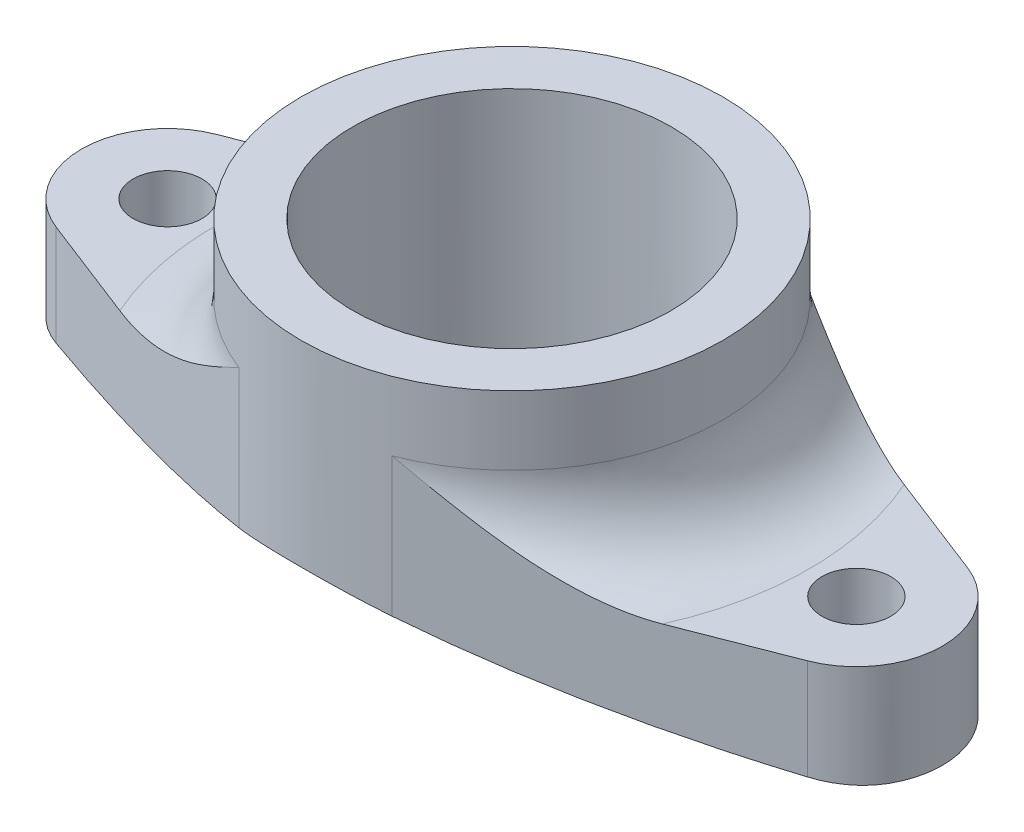
ISO-10303-21;
HEADER;
FILE_DESCRIPTION(('STEP AP214'),'2;1');
FILE_NAME('part.step','',(''),(''),'','','');
FILE_SCHEMA(('AUTOMOTIVE_DESIGN { 1 0 10303 214 1 1 1 1 }'));
ENDSEC;
DATA;
#1=APPLICATION_CONTEXT('core data for automotive mechanical design processes');
#2=APPLICATION_PROTOCOL_DEFINITION('international standard','automotive_design',2000,#1);
#3=PRODUCT_CONTEXT('',#1,'mechanical');
#4=PRODUCT('Part','Part','',(#3));
#5=PRODUCT_RELATED_PRODUCT_CATEGORY('part','',(#4));
#6=PRODUCT_DEFINITION_FORMATION('','',#4);
#7=PRODUCT_DEFINITION_CONTEXT('part definition',#1,'design');
#8=PRODUCT_DEFINITION('design','',#6,#7);
#9=PRODUCT_DEFINITION_SHAPE('','',#8);
#10=(LENGTH_UNIT() NAMED_UNIT(*) SI_UNIT(.MILLI.,.METRE.));
#11=(NAMED_UNIT(*) PLANE_ANGLE_UNIT() SI_UNIT($,.RADIAN.));
#12=(NAMED_UNIT(*) SI_UNIT($,.STERADIAN.) SOLID_ANGLE_UNIT());
#13=UNCERTAINTY_MEASURE_WITH_UNIT(LENGTH_MEASURE(1.E-05),#10,'distance_accuracy_value','');
#14=(GEOMETRIC_REPRESENTATION_CONTEXT(3) GLOBAL_UNCERTAINTY_ASSIGNED_CONTEXT((#13)) GLOBAL_UNIT_ASSIGNED_CONTEXT((#10,
#11,#12)) REPRESENTATION_CONTEXT('',''));
#15=CARTESIAN_POINT('',(0.,0.,0.));
#16=DIRECTION('',(0.,0.,1.));
#17=DIRECTION('',(1.,0.,0.));
#18=AXIS2_PLACEMENT_3D('',#15,#16,#17);
#19=CARTESIAN_POINT('',(43.625,30.,9.31983771317934));
#20=DIRECTION('',(-0.3625,0.,-0.931983771317935));
#21=DIRECTION('',(0.931983771317935,0.,-0.3625));
#22=AXIS2_PLACEMENT_3D('',#19,#20,#21);
#23=PLANE('',#22);
#24=DIRECTION('',(0.,-1.,0.));
#25=VECTOR('',#24,1.);
#26=CARTESIAN_POINT('',(43.625,30.,9.31983771317934));
#27=LINE('',#26,#25);
#28=CARTESIAN_POINT('',(43.625,12.,9.31983771317934));
#29=VERTEX_POINT('',#28);
#30=CARTESIAN_POINT('',(43.625,0.312645753927591,9.31983771317934));
#31=VERTEX_POINT('',#30);
#32=EDGE_CURVE('E186',#29,#31,#27,.T.);
#33=ORIENTED_EDGE('',*,*,#32,.F.);
#34=DIRECTION('',(-0.931983771317935,0.,0.3625));
#35=VECTOR('',#34,1.);
#36=CARTESIAN_POINT('',(43.625,12.,9.31983771317934));
#37=LINE('',#36,#35);
#38=CARTESIAN_POINT('',(31.5190571486617,12.,14.0285079912083));
#39=VERTEX_POINT('',#38);
#40=EDGE_CURVE('E290',#29,#39,#37,.T.);
#41=ORIENTED_EDGE('',*,*,#40,.T.);
#42=CARTESIAN_POINT('',(31.5190571486617,12.,14.0285079912083));
#43=CARTESIAN_POINT('',(31.2081161362249,12.0000073378622,14.1494501368521));
#44=CARTESIAN_POINT('',(30.8972525904942,12.0082756531448,14.2703621514122));
#45=CARTESIAN_POINT('',(30.2763168687535,12.0403376641738,14.5118783731085));
#46=CARTESIAN_POINT('',(29.9662444667264,12.0641262695673,14.6324826681553));
#47=CARTESIAN_POINT('',(29.0391969426042,12.1571533080677,14.9930626887913));
#48=CARTESIAN_POINT('',(28.4240461430392,12.2480616970899,15.2323288345172));
#49=CARTESIAN_POINT('',(27.2122428855278,12.4783617337884,15.7036660984984));
#50=CARTESIAN_POINT('',(26.61545225371,12.6169420095869,15.9357909602093));
#51=CARTESIAN_POINT('',(25.4315623110756,12.9364455773892,16.3962711932482));
#52=CARTESIAN_POINT('',(24.8444683375353,13.117391408088,16.6246244886145));
#53=CARTESIAN_POINT('',(23.5755848460668,13.5518396718945,17.1181634104424));
#54=CARTESIAN_POINT('',(22.8959525829643,13.8125506148254,17.3825099612694));
#55=CARTESIAN_POINT('',(21.5519217989401,14.376133244832,17.9052778186108));
#56=CARTESIAN_POINT('',(20.8875292825177,14.6790212283797,18.1636967896434));
#57=CARTESIAN_POINT('',(19.5725136091469,15.3195610469767,18.6751790667681));
#58=CARTESIAN_POINT('',(18.921909889942,15.6572584712307,18.9282348124473));
#59=CARTESIAN_POINT('',(17.6339001229477,16.3601085811493,19.4292129999485));
#60=CARTESIAN_POINT('',(16.9964926103165,16.725258198422,19.6771360115285));
#61=CARTESIAN_POINT('',(15.090378239101,17.8586796798977,20.4185292426451));
#62=CARTESIAN_POINT('',(13.8385669567911,18.6594284513701,20.9054278387394));
#63=CARTESIAN_POINT('',(11.359773366539,20.3011376891648,21.8695676704831));
#64=CARTESIAN_POINT('',(10.1327780960866,21.142076347799,22.3468139479692));
#65=CARTESIAN_POINT('',(8.89764093223173,21.9887639871967,22.8272270578073));
#66=CARTESIAN_POINT('',(8.88944546671112,21.9943819936824,22.8304147273168));
#67=CARTESIAN_POINT('',(8.88125,22.,22.8336023972894));
#68=B_SPLINE_CURVE_WITH_KNOTS('',3,(#42,#43,#44,#45,#46,#47,#48,#49,#50,#51,#52,#53,#54,#55,#56,
#57,#58,#59,#60,#61,#62,#63,#64,#65,#66,#67),.UNSPECIFIED.,.F.,.F.,(4,2,2,2,2,2,2,2,2,2,2,2,4),
(0.,1.0006596436552,2.00099125531729,3.99733968031262,5.96126632802749,7.92624017854258,
10.2479281160946,12.5705156153714,14.8961845684894,17.2215939618437,21.9107675400887,
26.5974249619817,26.6287299136658),.UNSPECIFIED.);
#69=CARTESIAN_POINT('',(8.88125,22.,22.8336023972894));
#70=VERTEX_POINT('',#69);
#71=EDGE_CURVE('E247',#70,#39,#68,.F.);
#72=ORIENTED_EDGE('',*,*,#71,.F.);
#73=DIRECTION('',(0.,-1.,0.));
#74=VECTOR('',#73,1.);
#75=CARTESIAN_POINT('',(8.88125,30.,22.8336023972894));
#76=LINE('',#75,#74);
#77=CARTESIAN_POINT('',(8.88125,5.87609845950715,22.8336023972894));
#78=VERTEX_POINT('',#77);
#79=EDGE_CURVE('E183',#70,#78,#76,.T.);
#80=ORIENTED_EDGE('',*,*,#79,.T.);
#81=CARTESIAN_POINT('',(54.7312583266492,30.,5.));
#82=DIRECTION('',(0.3625,0.,0.931983771317935));
#83=DIRECTION('',(0.931983771317934,0.,-0.3625));
#84=AXIS2_PLACEMENT_3D('',#81,#82,#83);
#85=ELLIPSE('',#84,82.7586206896551,30.);
#86=EDGE_CURVE('E319',#31,#78,#85,.F.);
#87=ORIENTED_EDGE('',*,*,#86,.F.);
#88=EDGE_LOOP('',(#33,#41,#72,#80,#87));
#89=FACE_BOUND('',#88,.T.);
#90=ADVANCED_FACE('F39',(#89),#23,.F.);
#91=CARTESIAN_POINT('',(-43.625,30.,9.31983771317934));
#92=DIRECTION('',(0.3625,0.,-0.931983771317935));
#93=DIRECTION('',(0.931983771317935,0.,0.3625));
#94=AXIS2_PLACEMENT_3D('',#91,#92,#93);
#95=PLANE('',#94);
#96=DIRECTION('',(0.,-1.,0.));
#97=VECTOR('',#96,1.);
#98=CARTESIAN_POINT('',(-8.88125,30.,22.8336023972894));
#99=LINE('',#98,#97);
#100=CARTESIAN_POINT('',(-8.88125,22.,22.8336023972894));
#101=VERTEX_POINT('',#100);
#102=CARTESIAN_POINT('',(-8.88125,5.87609845950715,22.8336023972894));
#103=VERTEX_POINT('',#102);
#104=EDGE_CURVE('E180',#101,#103,#99,.T.);
#105=ORIENTED_EDGE('',*,*,#104,.F.);
#106=CARTESIAN_POINT('',(-31.5190571486617,12.,14.0285079912083));
#107=CARTESIAN_POINT('',(-31.2081161362239,12.0000073378622,14.1494501368525));
#108=CARTESIAN_POINT('',(-30.8972525904923,12.0082756531449,14.270362151413));
#109=CARTESIAN_POINT('',(-30.2763168687496,12.040337664174,14.51187837311));
#110=CARTESIAN_POINT('',(-29.9662444667216,12.0641262695677,14.6324826681572));
#111=CARTESIAN_POINT('',(-29.0391969425969,12.1571533080686,14.9930626887942));
#112=CARTESIAN_POINT('',(-28.4240461430304,12.2480616970913,15.2323288345206));
#113=CARTESIAN_POINT('',(-27.2122428855195,12.4783617337903,15.7036660985017));
#114=CARTESIAN_POINT('',(-26.6154522537036,12.6169420095885,15.9357909602118));
#115=CARTESIAN_POINT('',(-25.4315623110725,12.9364455773901,16.3962711932494));
#116=CARTESIAN_POINT('',(-24.8444683375338,13.1173914080885,16.6246244886151));
#117=CARTESIAN_POINT('',(-23.5755848460671,13.5518396718944,17.1181634104423));
#118=CARTESIAN_POINT('',(-22.8959525829648,13.8125506148252,17.3825099612692));
#119=CARTESIAN_POINT('',(-21.5519217989413,14.3761332448315,17.9052778186103));
#120=CARTESIAN_POINT('',(-20.8875292825191,14.6790212283791,18.1636967896429));
#121=CARTESIAN_POINT('',(-19.5725136091495,15.3195610469753,18.6751790667671));
#122=CARTESIAN_POINT('',(-18.9219098899453,15.6572584712285,18.928234812446));
#123=CARTESIAN_POINT('',(-17.6339001229531,16.3601085811467,19.4292129999464));
#124=CARTESIAN_POINT('',(-16.9964926103232,16.7252581984198,19.6771360115259));
#125=CARTESIAN_POINT('',(-15.0903782391053,17.8586796798914,20.4185292426434));
#126=CARTESIAN_POINT('',(-13.8385669567876,18.6594284513527,20.9054278387407));
#127=CARTESIAN_POINT('',(-11.3597733665503,20.301137689177,21.8695676704787));
#128=CARTESIAN_POINT('',(-10.1327780961203,21.1420763478519,22.3468139479563));
#129=CARTESIAN_POINT('',(-8.89764093223234,21.9887639871973,22.827227057807));
#130=CARTESIAN_POINT('',(-8.88944546671143,21.9943819936827,22.8304147273167));
#131=CARTESIAN_POINT('',(-8.88125,22.,22.8336023972894));
#132=B_SPLINE_CURVE_WITH_KNOTS('',3,(#106,#107,#108,#109,#110,#111,#112,#113,#114,#115,#116,
#117,#118,#119,#120,#121,#122,#123,#124,#125,#126,#127,#128,#129,#130,#131),.UNSPECIFIED.,.F.,
.F.,(4,2,2,2,2,2,2,2,2,2,2,2,4),(0.,1.00065964365832,2.00099125532354,3.99733968032373,
5.9612663280326,7.92624017854259,10.2479281160937,12.5705156153693,14.8961845684841,
17.2215939618355,21.9107675400835,26.5974249619813,26.6287299136658),.UNSPECIFIED.);
#133=CARTESIAN_POINT('',(-31.5190571486617,12.,14.0285079912083));
#134=VERTEX_POINT('',#133);
#135=EDGE_CURVE('E52',#134,#101,#132,.T.);
#136=ORIENTED_EDGE('',*,*,#135,.F.);
#137=DIRECTION('',(-0.931983771317935,0.,-0.3625));
#138=VECTOR('',#137,1.);
#139=CARTESIAN_POINT('',(-43.625,12.,9.31983771317934));
#140=LINE('',#139,#138);
#141=CARTESIAN_POINT('',(-43.625,12.,9.31983771317934));
#142=VERTEX_POINT('',#141);
#143=EDGE_CURVE('E282',#134,#142,#140,.T.);
#144=ORIENTED_EDGE('',*,*,#143,.T.);
#145=DIRECTION('',(0.,-1.,0.));
#146=VECTOR('',#145,1.);
#147=CARTESIAN_POINT('',(-43.625,30.,9.31983771317934));
#148=LINE('',#147,#146);
#149=CARTESIAN_POINT('',(-43.625,0.312645753927591,9.31983771317934));
#150=VERTEX_POINT('',#149);
#151=EDGE_CURVE('E178',#142,#150,#148,.T.);
#152=ORIENTED_EDGE('',*,*,#151,.T.);
#153=CARTESIAN_POINT('',(-54.7312583266492,30.,5.));
#154=DIRECTION('',(-0.3625,0.,0.931983771317935));
#155=DIRECTION('',(0.931983771317934,0.,0.3625));
#156=AXIS2_PLACEMENT_3D('',#153,#154,#155);
#157=ELLIPSE('',#156,82.7586206896551,30.);
#158=EDGE_CURVE('E149',#103,#150,#157,.F.);
#159=ORIENTED_EDGE('',*,*,#158,.F.);
#160=EDGE_LOOP('',(#105,#136,#144,#152,#159));
#161=FACE_BOUND('',#160,.T.);
#162=ADVANCED_FACE('F232',(#161),#95,.F.);
#163=CARTESIAN_POINT('',(-40.,30.,0.));
#164=DIRECTION('',(0.,1.,0.));
#165=DIRECTION('',(0.,0.,-1.));
#166=AXIS2_PLACEMENT_3D('',#163,#164,#165);
#167=PLANE('',#166);
#168=CARTESIAN_POINT('',(0.,30.,0.));
#169=DIRECTION('',(0.,-1.,0.));
#170=DIRECTION('',(0.,0.,-1.));
#171=AXIS2_PLACEMENT_3D('',#168,#169,#170);
#172=CIRCLE('',#171,18.5);
#173=CARTESIAN_POINT('',(0.,30.,-18.5));
#174=VERTEX_POINT('',#173);
#175=EDGE_CURVE('E298',#174,#174,#172,.T.);
#176=ORIENTED_EDGE('',*,*,#175,.T.);
#177=EDGE_LOOP('',(#176));
#178=FACE_BOUND('',#177,.T.);
#179=CARTESIAN_POINT('',(0.,30.,0.));
#180=DIRECTION('',(0.,-1.,0.));
#181=DIRECTION('',(0.,0.,-1.));
#182=AXIS2_PLACEMENT_3D('',#179,#180,#181);
#183=CIRCLE('',#182,24.5);
#184=CARTESIAN_POINT('',(0.,30.,-24.5));
#185=VERTEX_POINT('',#184);
#186=EDGE_CURVE('E169',#185,#185,#183,.T.);
#187=ORIENTED_EDGE('',*,*,#186,.F.);
#188=EDGE_LOOP('',(#187));
#189=FACE_BOUND('',#188,.T.);
#190=ADVANCED_FACE('F229',(#178,#189),#167,.T.);
#191=CARTESIAN_POINT('',(-40.,30.,0.));
#192=DIRECTION('',(0.,-1.,0.));
#193=DIRECTION('',(0.,0.,1.));
#194=AXIS2_PLACEMENT_3D('',#191,#192,#193);
#195=CYLINDRICAL_SURFACE('',#194,10.);
#196=ORIENTED_EDGE('',*,*,#151,.F.);
#197=CARTESIAN_POINT('',(-40.,12.,0.));
#198=DIRECTION('',(0.,-1.,0.));
#199=DIRECTION('',(0.,0.,-1.));
#200=AXIS2_PLACEMENT_3D('',#197,#198,#199);
#201=CIRCLE('',#200,10.);
#202=CARTESIAN_POINT('',(-43.625,12.,-9.31983771317934));
#203=VERTEX_POINT('',#202);
#204=EDGE_CURVE('E285',#142,#203,#201,.T.);
#205=ORIENTED_EDGE('',*,*,#204,.T.);
#206=DIRECTION('',(0.,-1.,0.));
#207=VECTOR('',#206,1.);
#208=CARTESIAN_POINT('',(-43.625,30.,-9.31983771317934));
#209=LINE('',#208,#207);
#210=CARTESIAN_POINT('',(-43.625,0.,-9.31983771317934));
#211=VERTEX_POINT('',#210);
#212=EDGE_CURVE('E159',#203,#211,#209,.T.);
#213=ORIENTED_EDGE('',*,*,#212,.T.);
#214=CARTESIAN_POINT('',(-40.,0.,0.));
#215=DIRECTION('',(0.,-1.,0.));
#216=DIRECTION('',(0.,0.,-1.));
#217=AXIS2_PLACEMENT_3D('',#214,#215,#216);
#218=CIRCLE('',#217,10.);
#219=CARTESIAN_POINT('',(-48.6602540378444,0.,5.));
#220=VERTEX_POINT('',#219);
#221=EDGE_CURVE('E136',#220,#211,#218,.T.);
#222=ORIENTED_EDGE('',*,*,#221,.F.);
#223=CARTESIAN_POINT('',(-43.625,0.312645753927591,9.31983771317934));
#224=CARTESIAN_POINT('',(-43.8906446330587,0.297631880689769,9.21654498200811));
#225=CARTESIAN_POINT('',(-44.1517886661367,0.281479059018539,9.10186717163776));
#226=CARTESIAN_POINT('',(-44.6632556431704,0.247885068324826,8.85070907405849));
#227=CARTESIAN_POINT('',(-44.9135796727376,0.230444029031932,8.71423098063593));
#228=CARTESIAN_POINT('',(-45.3948601591342,0.195748558874338,8.42450083774856));
#229=CARTESIAN_POINT('',(-45.6261615002218,0.178502408826851,8.27182025011787));
#230=CARTESIAN_POINT('',(-46.0753313533576,0.14472896576148,7.94776867802888));
#231=CARTESIAN_POINT('',(-46.2932000930703,0.128201660561536,7.77639801047884));
#232=CARTESIAN_POINT('',(-46.7150549148254,0.0968279305301048,7.4152215022743));
#233=CARTESIAN_POINT('',(-46.9189687112306,0.081990027155304,7.22533046047197));
#234=CARTESIAN_POINT('',(-47.310335030288,0.0551531862495344,6.82909642330728));
#235=CARTESIAN_POINT('',(-47.4977876225804,0.0431542367078158,6.62275349755277));
#236=CARTESIAN_POINT('',(-47.8600204335456,0.0227587622856527,6.18887372773224));
#237=CARTESIAN_POINT('',(-48.0342828919757,0.0144754481922001,5.96089871642284));
#238=CARTESIAN_POINT('',(-48.3626987215498,0.00308648482398966,5.4906948003193));
#239=CARTESIAN_POINT('',(-48.516847000641,-1.78556905197176E-05,5.24846230857326));
#240=CARTESIAN_POINT('',(-48.6602540378444,0.,4.99999999999999));
#241=B_SPLINE_CURVE_WITH_KNOTS('',3,(#223,#224,#225,#226,#227,#228,#229,#230,#231,#232,#233,
#234,#235,#236,#237,#238,#239,#240),.UNSPECIFIED.,.F.,.F.,(4,2,2,2,2,2,2,2,4),(0.,
0.85597447723451,1.71186287102264,2.543969157431,3.37606133687079,4.21218031525811,
5.04829575621718,5.90839558740339,6.7687127384959),.UNSPECIFIED.);
#242=EDGE_CURVE('E146',#150,#220,#241,.T.);
#243=ORIENTED_EDGE('',*,*,#242,.F.);
#244=EDGE_LOOP('',(#196,#205,#213,#222,#243));
#245=FACE_BOUND('',#244,.T.);
#246=ADVANCED_FACE('F156',(#245),#195,.T.);
#247=CARTESIAN_POINT('',(-43.625,30.,-9.31983771317934));
#248=DIRECTION('',(0.3625,0.,0.931983771317935));
#249=DIRECTION('',(-0.931983771317935,0.,0.3625));
#250=AXIS2_PLACEMENT_3D('',#247,#248,#249);
#251=PLANE('',#250);
#252=DIRECTION('',(0.931983771317935,0.,-0.3625));
#253=VECTOR('',#252,1.);
#254=CARTESIAN_POINT('',(-43.625,12.,-9.31983771317934));
#255=LINE('',#254,#253);
#256=CARTESIAN_POINT('',(-31.5190571486617,12.,-14.0285079912083));
#257=VERTEX_POINT('',#256);
#258=EDGE_CURVE('E287',#203,#257,#255,.T.);
#259=ORIENTED_EDGE('',*,*,#258,.T.);
#260=CARTESIAN_POINT('',(-31.5190571486617,12.,-14.0285079912083));
#261=CARTESIAN_POINT('',(-31.2081161362251,12.0000073378621,-14.149450136852));
#262=CARTESIAN_POINT('',(-30.8972525904946,12.0082756531448,-14.270362151412));
#263=CARTESIAN_POINT('',(-30.2763168687544,12.0403376641737,-14.5118783731082));
#264=CARTESIAN_POINT('',(-29.9662444667275,12.0641262695672,-14.6324826681549));
#265=CARTESIAN_POINT('',(-29.0391969426059,12.1571533080674,-14.9930626887907));
#266=CARTESIAN_POINT('',(-28.4240461430412,12.2480616970896,-15.2323288345165));
#267=CARTESIAN_POINT('',(-27.2122428855297,12.478361733788,-15.7036660984977));
#268=CARTESIAN_POINT('',(-26.6154522537115,12.6169420095865,-15.9357909602087));
#269=CARTESIAN_POINT('',(-25.4315623110763,12.936445577389,-16.396271193248));
#270=CARTESIAN_POINT('',(-24.8444683375357,13.1173914080879,-16.6246244886144));
#271=CARTESIAN_POINT('',(-23.5755848460668,13.5518396718945,-17.1181634104424));
#272=CARTESIAN_POINT('',(-22.8959525829642,13.8125506148254,-17.3825099612695));
#273=CARTESIAN_POINT('',(-21.55192179894,14.3761332448321,-17.9052778186108));
#274=CARTESIAN_POINT('',(-20.8875292825174,14.6790212283798,-18.1636967896435));
#275=CARTESIAN_POINT('',(-19.5725136091465,15.3195610469769,-18.6751790667682));
#276=CARTESIAN_POINT('',(-18.9219098899414,15.6572584712311,-18.9282348124475));
#277=CARTESIAN_POINT('',(-17.6339001229467,16.3601085811497,-19.4292129999489));
#278=CARTESIAN_POINT('',(-16.9964926103151,16.7252581984224,-19.677136011529));
#279=CARTESIAN_POINT('',(-15.0903782391003,17.8586796798989,-20.4185292426454));
#280=CARTESIAN_POINT('',(-13.8385669567922,18.6594284513738,-20.905427838739));
#281=CARTESIAN_POINT('',(-11.3597733665368,20.3011376891617,-21.8695676704839));
#282=CARTESIAN_POINT('',(-10.1327780960792,21.1420763477865,-22.3468139479719));
#283=CARTESIAN_POINT('',(-8.89764093223191,21.9887639871963,-22.8272270578072));
#284=CARTESIAN_POINT('',(-8.88944546671122,21.9943819936823,-22.8304147273168));
#285=CARTESIAN_POINT('',(-8.88125000000001,22.,-22.8336023972894));
#286=B_SPLINE_CURVE_WITH_KNOTS('',3,(#260,#261,#262,#263,#264,#265,#266,#267,#268,#269,#270,
#271,#272,#273,#274,#275,#276,#277,#278,#279,#280,#281,#282,#283,#284,#285),.UNSPECIFIED.,.F.,
.F.,(4,2,2,2,2,2,2,2,2,2,2,2,4),(0.,1.00065964365448,2.00099125531586,3.99733968031007,
5.96126632802632,7.92624017854258,10.2479281160947,12.5705156153717,14.8961845684904,
17.2215939618453,21.9107675400894,26.5974249619812,26.6287299136658),.UNSPECIFIED.);
#287=CARTESIAN_POINT('',(-8.88125000000001,22.,-22.8336023972894));
#288=VERTEX_POINT('',#287);
#289=EDGE_CURVE('E12',#288,#257,#286,.F.);
#290=ORIENTED_EDGE('',*,*,#289,.F.);
#291=DIRECTION('',(0.,-1.,0.));
#292=VECTOR('',#291,1.);
#293=CARTESIAN_POINT('',(-8.88125000000001,30.,-22.8336023972894));
#294=LINE('',#293,#292);
#295=CARTESIAN_POINT('',(-8.88125000000001,0.,-22.8336023972894));
#296=VERTEX_POINT('',#295);
#297=EDGE_CURVE('E195',#288,#296,#294,.T.);
#298=ORIENTED_EDGE('',*,*,#297,.T.);
#299=DIRECTION('',(0.931983771317934,0.,-0.3625));
#300=VECTOR('',#299,1.);
#301=CARTESIAN_POINT('',(-43.625,0.,-9.31983771317934));
#302=LINE('',#301,#300);
#303=EDGE_CURVE('E160',#211,#296,#302,.T.);
#304=ORIENTED_EDGE('',*,*,#303,.F.);
#305=ORIENTED_EDGE('',*,*,#212,.F.);
#306=EDGE_LOOP('',(#259,#290,#298,#304,#305));
#307=FACE_BOUND('',#306,.T.);
#308=ADVANCED_FACE('F269',(#307),#251,.F.);
#309=CARTESIAN_POINT('',(43.625,30.,-9.31983771317934));
#310=DIRECTION('',(-0.3625,0.,0.931983771317935));
#311=DIRECTION('',(-0.931983771317935,0.,-0.3625));
#312=AXIS2_PLACEMENT_3D('',#309,#310,#311);
#313=PLANE('',#312);
#314=DIRECTION('',(0.931983771317935,0.,0.3625));
#315=VECTOR('',#314,1.);
#316=CARTESIAN_POINT('',(43.625,12.,-9.31983771317934));
#317=LINE('',#316,#315);
#318=CARTESIAN_POINT('',(31.5190571486617,12.,-14.0285079912083));
#319=VERTEX_POINT('',#318);
#320=CARTESIAN_POINT('',(43.625,12.,-9.31983771317934));
#321=VERTEX_POINT('',#320);
#322=EDGE_CURVE('E295',#319,#321,#317,.T.);
#323=ORIENTED_EDGE('',*,*,#322,.T.);
#324=DIRECTION('',(0.,-1.,0.));
#325=VECTOR('',#324,1.);
#326=CARTESIAN_POINT('',(43.625,30.,-9.31983771317934));
#327=LINE('',#326,#325);
#328=CARTESIAN_POINT('',(43.625,0.,-9.31983771317934));
#329=VERTEX_POINT('',#328);
#330=EDGE_CURVE('E189',#321,#329,#327,.T.);
#331=ORIENTED_EDGE('',*,*,#330,.T.);
#332=DIRECTION('',(0.931983771317934,0.,0.3625));
#333=VECTOR('',#332,1.);
#334=CARTESIAN_POINT('',(43.625,0.,-9.31983771317934));
#335=LINE('',#334,#333);
#336=CARTESIAN_POINT('',(8.88125,0.,-22.8336023972894));
#337=VERTEX_POINT('',#336);
#338=EDGE_CURVE('E172',#337,#329,#335,.T.);
#339=ORIENTED_EDGE('',*,*,#338,.F.);
#340=DIRECTION('',(0.,-1.,0.));
#341=VECTOR('',#340,1.);
#342=CARTESIAN_POINT('',(8.88125,30.,-22.8336023972894));
#343=LINE('',#342,#341);
#344=CARTESIAN_POINT('',(8.88125,22.,-22.8336023972894));
#345=VERTEX_POINT('',#344);
#346=EDGE_CURVE('E192',#345,#337,#343,.T.);
#347=ORIENTED_EDGE('',*,*,#346,.F.);
#348=CARTESIAN_POINT('',(31.5190571486617,12.,-14.0285079912083));
#349=CARTESIAN_POINT('',(31.2081161362239,12.0000073378622,-14.1494501368525));
#350=CARTESIAN_POINT('',(30.8972525904923,12.0082756531449,-14.270362151413));
#351=CARTESIAN_POINT('',(30.2763168687496,12.040337664174,-14.51187837311));
#352=CARTESIAN_POINT('',(29.9662444667216,12.0641262695677,-14.6324826681572));
#353=CARTESIAN_POINT('',(29.0391969425969,12.1571533080686,-14.9930626887942));
#354=CARTESIAN_POINT('',(28.4240461430304,12.2480616970913,-15.2323288345206));
#355=CARTESIAN_POINT('',(27.2122428855195,12.4783617337903,-15.7036660985017));
#356=CARTESIAN_POINT('',(26.6154522537036,12.6169420095885,-15.9357909602118));
#357=CARTESIAN_POINT('',(25.4315623110725,12.9364455773901,-16.3962711932494));
#358=CARTESIAN_POINT('',(24.8444683375338,13.1173914080885,-16.6246244886151));
#359=CARTESIAN_POINT('',(23.5755848460671,13.5518396718944,-17.1181634104423));
#360=CARTESIAN_POINT('',(22.8959525829648,13.8125506148252,-17.3825099612692));
#361=CARTESIAN_POINT('',(21.5519217989413,14.3761332448315,-17.9052778186103));
#362=CARTESIAN_POINT('',(20.8875292825191,14.6790212283791,-18.1636967896429));
#363=CARTESIAN_POINT('',(19.5725136091495,15.3195610469753,-18.6751790667671));
#364=CARTESIAN_POINT('',(18.9219098899453,15.6572584712285,-18.928234812446));
#365=CARTESIAN_POINT('',(17.6339001229531,16.3601085811467,-19.4292129999464));
#366=CARTESIAN_POINT('',(16.9964926103232,16.7252581984198,-19.6771360115259));
#367=CARTESIAN_POINT('',(15.0903782391053,17.8586796798914,-20.4185292426434));
#368=CARTESIAN_POINT('',(13.8385669567876,18.6594284513527,-20.9054278387407));
#369=CARTESIAN_POINT('',(11.3597733665503,20.301137689177,-21.8695676704787));
#370=CARTESIAN_POINT('',(10.1327780961203,21.1420763478519,-22.3468139479563));
#371=CARTESIAN_POINT('',(8.89764093223234,21.9887639871973,-22.827227057807));
#372=CARTESIAN_POINT('',(8.88944546671143,21.9943819936827,-22.8304147273167));
#373=CARTESIAN_POINT('',(8.88125,22.,-22.8336023972894));
#374=B_SPLINE_CURVE_WITH_KNOTS('',3,(#348,#349,#350,#351,#352,#353,#354,#355,#356,#357,#358,
#359,#360,#361,#362,#363,#364,#365,#366,#367,#368,#369,#370,#371,#372,#373),.UNSPECIFIED.,.F.,
.F.,(4,2,2,2,2,2,2,2,2,2,2,2,4),(0.,1.00065964365832,2.00099125532354,3.99733968032373,
5.9612663280326,7.92624017854259,10.2479281160937,12.5705156153693,14.8961845684841,
17.2215939618355,21.9107675400835,26.5974249619813,26.6287299136658),.UNSPECIFIED.);
#375=EDGE_CURVE('E253',#319,#345,#374,.T.);
#376=ORIENTED_EDGE('',*,*,#375,.F.);
#377=EDGE_LOOP('',(#323,#331,#339,#347,#376));
#378=FACE_BOUND('',#377,.T.);
#379=ADVANCED_FACE('F325',(#378),#313,.F.);
#380=CARTESIAN_POINT('',(40.,30.,0.));
#381=DIRECTION('',(0.,-1.,0.));
#382=DIRECTION('',(0.,0.,1.));
#383=AXIS2_PLACEMENT_3D('',#380,#381,#382);
#384=CYLINDRICAL_SURFACE('',#383,10.);
#385=CARTESIAN_POINT('',(40.,0.,0.));
#386=DIRECTION('',(0.,-1.,0.));
#387=DIRECTION('',(0.,0.,-1.));
#388=AXIS2_PLACEMENT_3D('',#385,#386,#387);
#389=CIRCLE('',#388,10.);
#390=CARTESIAN_POINT('',(48.6602540378444,0.,5.));
#391=VERTEX_POINT('',#390);
#392=EDGE_CURVE('E175',#329,#391,#389,.T.);
#393=ORIENTED_EDGE('',*,*,#392,.F.);
#394=ORIENTED_EDGE('',*,*,#330,.F.);
#395=CARTESIAN_POINT('',(40.,12.,0.));
#396=DIRECTION('',(0.,-1.,0.));
#397=DIRECTION('',(0.,0.,-1.));
#398=AXIS2_PLACEMENT_3D('',#395,#396,#397);
#399=CIRCLE('',#398,10.);
#400=EDGE_CURVE('E293',#321,#29,#399,.T.);
#401=ORIENTED_EDGE('',*,*,#400,.T.);
#402=ORIENTED_EDGE('',*,*,#32,.T.);
#403=CARTESIAN_POINT('',(48.6602540378444,0.,4.99999999999999));
#404=CARTESIAN_POINT('',(48.5185691644111,-1.70844560396226E-05,5.24547591033573));
#405=CARTESIAN_POINT('',(48.3664008964613,0.00301273220822736,5.48487204550711));
#406=CARTESIAN_POINT('',(48.0424122870708,0.0141411693843613,5.94976174896186));
#407=CARTESIAN_POINT('',(47.8705970943465,0.0222384643783513,6.1752589359028));
#408=CARTESIAN_POINT('',(47.5135449359068,0.042198907016938,6.60473448192679));
#409=CARTESIAN_POINT('',(47.3288086367448,0.0539520696617994,6.80913472575917));
#410=CARTESIAN_POINT('',(46.9432070020546,0.0802691890169725,7.20191696943386));
#411=CARTESIAN_POINT('',(46.7423412977168,0.094833210010129,7.39029860279706));
#412=CARTESIAN_POINT('',(46.3219350815211,0.126033976783659,7.75317224344646));
#413=CARTESIAN_POINT('',(46.1021149881299,0.142704472257274,7.9273375062961));
#414=CARTESIAN_POINT('',(45.6486651878263,0.176819891642444,8.25657936378109));
#415=CARTESIAN_POINT('',(45.4150349485001,0.194264845404736,8.41165522176335));
#416=CARTESIAN_POINT('',(44.9286213600491,0.229387468095767,8.70584567931382));
#417=CARTESIAN_POINT('',(44.6754794948524,0.247057275587526,8.84436894095083));
#418=CARTESIAN_POINT('',(44.1580958856825,0.281089217816377,9.09909633265312));
#419=CARTESIAN_POINT('',(43.8938532081183,0.297451242230198,9.21529858089792));
#420=CARTESIAN_POINT('',(43.625,0.312645753927594,9.31983771317934));
#421=B_SPLINE_CURVE_WITH_KNOTS('',3,(#403,#404,#405,#406,#407,#408,#409,#410,#411,#412,#413,
#414,#415,#416,#417,#418,#419,#420),.UNSPECIFIED.,.F.,.F.,(4,2,2,2,2,2,2,2,4),(0.,
0.849986420312887,1.69975059960554,2.52608564098224,3.35243958244439,4.19429105290884,
5.0361749999336,5.90240751731051,6.76871303223936),.UNSPECIFIED.);
#422=EDGE_CURVE('E154',#391,#31,#421,.T.);
#423=ORIENTED_EDGE('',*,*,#422,.F.);
#424=EDGE_LOOP('',(#393,#394,#401,#402,#423));
#425=FACE_BOUND('',#424,.T.);
#426=ADVANCED_FACE('F227',(#425),#384,.T.);
#427=CARTESIAN_POINT('',(-40.,30.,0.));
#428=DIRECTION('',(0.,-1.,0.));
#429=DIRECTION('',(0.,0.,1.));
#430=AXIS2_PLACEMENT_3D('',#427,#428,#429);
#431=CYLINDRICAL_SURFACE('',#430,4.);
#432=CARTESIAN_POINT('',(-40.,0.,0.));
#433=DIRECTION('',(0.,-1.,0.));
#434=DIRECTION('',(0.,0.,-1.));
#435=AXIS2_PLACEMENT_3D('',#432,#433,#434);
#436=CIRCLE('',#435,4.);
#437=CARTESIAN_POINT('',(-40.,0.,-4.));
#438=VERTEX_POINT('',#437);
#439=EDGE_CURVE('E161',#438,#438,#436,.T.);
#440=ORIENTED_EDGE('',*,*,#439,.T.);
#441=EDGE_LOOP('',(#440));
#442=FACE_BOUND('',#441,.T.);
#443=CARTESIAN_POINT('',(-40.,12.,0.));
#444=DIRECTION('',(0.,-1.,0.));
#445=DIRECTION('',(0.,0.,-1.));
#446=AXIS2_PLACEMENT_3D('',#443,#444,#445);
#447=CIRCLE('',#446,4.);
#448=CARTESIAN_POINT('',(-40.,12.,-4.));
#449=VERTEX_POINT('',#448);
#450=EDGE_CURVE('E202',#449,#449,#447,.T.);
#451=ORIENTED_EDGE('',*,*,#450,.F.);
#452=EDGE_LOOP('',(#451));
#453=FACE_BOUND('',#452,.T.);
#454=ADVANCED_FACE('F223',(#442,#453),#431,.F.);
#455=CARTESIAN_POINT('',(40.,30.,0.));
#456=DIRECTION('',(0.,-1.,0.));
#457=DIRECTION('',(0.,0.,1.));
#458=AXIS2_PLACEMENT_3D('',#455,#456,#457);
#459=CYLINDRICAL_SURFACE('',#458,4.00000000000001);
#460=CARTESIAN_POINT('',(40.,0.,0.));
#461=DIRECTION('',(0.,-1.,0.));
#462=DIRECTION('',(0.,0.,-1.));
#463=AXIS2_PLACEMENT_3D('',#460,#461,#462);
#464=CIRCLE('',#463,4.00000000000001);
#465=CARTESIAN_POINT('',(40.,0.,-4.00000000000001));
#466=VERTEX_POINT('',#465);
#467=EDGE_CURVE('E166',#466,#466,#464,.T.);
#468=ORIENTED_EDGE('',*,*,#467,.T.);
#469=EDGE_LOOP('',(#468));
#470=FACE_BOUND('',#469,.T.);
#471=CARTESIAN_POINT('',(40.,12.,0.));
#472=DIRECTION('',(0.,-1.,0.));
#473=DIRECTION('',(0.,0.,-1.));
#474=AXIS2_PLACEMENT_3D('',#471,#472,#473);
#475=CIRCLE('',#474,4.00000000000001);
#476=CARTESIAN_POINT('',(40.,12.,-4.00000000000001));
#477=VERTEX_POINT('',#476);
#478=EDGE_CURVE('E153',#477,#477,#475,.T.);
#479=ORIENTED_EDGE('',*,*,#478,.F.);
#480=EDGE_LOOP('',(#479));
#481=FACE_BOUND('',#480,.T.);
#482=ADVANCED_FACE('F220',(#470,#481),#459,.F.);
#483=CARTESIAN_POINT('',(-40.,0.,0.));
#484=DIRECTION('',(0.,1.,0.));
#485=DIRECTION('',(0.,0.,-1.));
#486=AXIS2_PLACEMENT_3D('',#483,#484,#485);
#487=PLANE('',#486);
#488=ORIENTED_EDGE('',*,*,#439,.F.);
#489=EDGE_LOOP('',(#488));
#490=FACE_BOUND('',#489,.T.);
#491=ORIENTED_EDGE('',*,*,#467,.F.);
#492=EDGE_LOOP('',(#491));
#493=FACE_BOUND('',#492,.T.);
#494=ORIENTED_EDGE('',*,*,#221,.T.);
#495=ORIENTED_EDGE('',*,*,#303,.T.);
#496=CARTESIAN_POINT('',(0.,0.,0.));
#497=DIRECTION('',(0.,-1.,0.));
#498=DIRECTION('',(0.,0.,-1.));
#499=AXIS2_PLACEMENT_3D('',#496,#497,#498);
#500=CIRCLE('',#499,24.5);
#501=EDGE_CURVE('E163',#296,#337,#500,.T.);
#502=ORIENTED_EDGE('',*,*,#501,.T.);
#503=ORIENTED_EDGE('',*,*,#338,.T.);
#504=ORIENTED_EDGE('',*,*,#392,.T.);
#505=DIRECTION('',(1.,0.,0.));
#506=VECTOR('',#505,1.);
#507=CARTESIAN_POINT('',(-50.,0.,5.));
#508=LINE('',#507,#506);
#509=CARTESIAN_POINT('',(17.8115131305569,0.,5.));
#510=VERTEX_POINT('',#509);
#511=EDGE_CURVE('E143',#510,#391,#508,.T.);
#512=ORIENTED_EDGE('',*,*,#511,.F.);
#513=CARTESIAN_POINT('',(0.,0.,0.));
#514=DIRECTION('',(0.,-1.,0.));
#515=DIRECTION('',(0.,0.,-1.));
#516=AXIS2_PLACEMENT_3D('',#513,#514,#515);
#517=CIRCLE('',#516,18.5);
#518=CARTESIAN_POINT('',(-17.8115131305569,0.,5.));
#519=VERTEX_POINT('',#518);
#520=EDGE_CURVE('E140',#519,#510,#517,.T.);
#521=ORIENTED_EDGE('',*,*,#520,.F.);
#522=EDGE_CURVE('E131',#220,#519,#508,.T.);
#523=ORIENTED_EDGE('',*,*,#522,.F.);
#524=EDGE_LOOP('',(#494,#495,#502,#503,#504,#512,#521,#523));
#525=FACE_BOUND('',#524,.T.);
#526=ADVANCED_FACE('F133',(#490,#493,#525),#487,.F.);
#527=CARTESIAN_POINT('',(0.,30.,0.));
#528=DIRECTION('',(0.,-1.,0.));
#529=DIRECTION('',(0.,0.,1.));
#530=AXIS2_PLACEMENT_3D('',#527,#528,#529);
#531=CYLINDRICAL_SURFACE('',#530,24.5);
#532=ORIENTED_EDGE('',*,*,#346,.T.);
#533=ORIENTED_EDGE('',*,*,#501,.F.);
#534=ORIENTED_EDGE('',*,*,#297,.F.);
#535=CARTESIAN_POINT('',(0.,22.,0.));
#536=DIRECTION('',(0.,-1.,0.));
#537=DIRECTION('',(0.,0.,-1.));
#538=AXIS2_PLACEMENT_3D('',#535,#536,#537);
#539=CIRCLE('',#538,24.5);
#540=EDGE_CURVE('E329',#101,#288,#539,.T.);
#541=ORIENTED_EDGE('',*,*,#540,.F.);
#542=ORIENTED_EDGE('',*,*,#104,.T.);
#543=CARTESIAN_POINT('',(23.9843699104229,0.,4.99999999999999));
#544=CARTESIAN_POINT('',(23.9211559577665,-9.20971221211301E-06,5.30327450071418));
#545=CARTESIAN_POINT('',(23.8521746353166,0.00459851924593874,5.60533371947271));
#546=CARTESIAN_POINT('',(23.7028918697867,0.0227590821700775,6.20634057840401));
#547=CARTESIAN_POINT('',(23.622591530425,0.0363110444568779,6.50528851890941));
#548=CARTESIAN_POINT('',(23.4509563886905,0.0720540360260349,7.0991624573293));
#549=CARTESIAN_POINT('',(23.3596323855747,0.0942366569634952,7.39409208148276));
#550=CARTESIAN_POINT('',(23.1661594769139,0.146886727321369,7.97960921553937));
#551=CARTESIAN_POINT('',(23.0640103566838,0.177354341069631,8.27019663919696));
#552=CARTESIAN_POINT('',(22.7434135295707,0.280085335277424,9.1301263120883));
#553=CARTESIAN_POINT('',(22.5094314340404,0.363975960196523,9.692410941227));
#554=CARTESIAN_POINT('',(22.002422213712,0.559512312186617,10.7940451938524));
#555=CARTESIAN_POINT('',(21.7293866720134,0.671164026239785,11.3333898406607));
#556=CARTESIAN_POINT('',(21.1480454075838,0.917991793231831,12.3842370172212));
#557=CARTESIAN_POINT('',(20.8398792759125,1.05307578315101,12.8958385885953));
#558=CARTESIAN_POINT('',(20.1900209583542,1.34315545302427,13.8912345393215));
#559=CARTESIAN_POINT('',(19.8483302540789,1.49815025311767,14.3750301460553));
#560=CARTESIAN_POINT('',(19.1330004368488,1.8244240104206,15.3142921647479));
#561=CARTESIAN_POINT('',(18.7592941017593,1.99573731976125,15.7696953203171));
#562=CARTESIAN_POINT('',(17.9826582090524,2.35030873629465,16.6498811790316));
#563=CARTESIAN_POINT('',(17.579726886098,2.53356756498932,17.0746620293394));
#564=CARTESIAN_POINT('',(16.6968117128728,2.93020489586965,17.941387675195));
#565=CARTESIAN_POINT('',(16.2133652314313,3.14457200324373,18.3793565022276));
#566=CARTESIAN_POINT('',(15.2141494152261,3.57720225259249,19.2146765768324));
#567=CARTESIAN_POINT('',(14.6983765785241,3.795465814835,19.6120234114835));
#568=CARTESIAN_POINT('',(13.6361645400449,4.22968899950248,20.3648921724352));
#569=CARTESIAN_POINT('',(13.0897230391136,4.44564844774549,20.7204109567874));
#570=CARTESIAN_POINT('',(11.9676816779407,4.86861690637881,21.3880973148273));
#571=CARTESIAN_POINT('',(11.3920849625457,5.07562687766463,21.7002695505868));
#572=CARTESIAN_POINT('',(10.2750501071762,5.45269314812981,22.2490194986968));
#573=CARTESIAN_POINT('',(9.73636023751087,5.62434812463729,22.4900916537737));
#574=CARTESIAN_POINT('',(8.63815358369498,5.9493056767509,22.9343207457605));
#575=CARTESIAN_POINT('',(8.07863800100065,6.10260930891984,23.1374798658574));
#576=CARTESIAN_POINT('',(6.94145227144753,6.38501215413045,23.5036703024647));
#577=CARTESIAN_POINT('',(6.36380711142223,6.51414310796458,23.6667543303017));
#578=CARTESIAN_POINT('',(5.19249454388604,6.74290575352428,23.9510143286565));
#579=CARTESIAN_POINT('',(4.59882758500785,6.842538270314,24.0721914713157));
#580=CARTESIAN_POINT('',(3.39353439887662,7.0082076487074,24.2716000948445));
#581=CARTESIAN_POINT('',(2.7817893718418,7.07390674280771,24.3494003945234));
#582=CARTESIAN_POINT('',(1.55122021475307,7.16654971499094,24.4586422616614));
#583=CARTESIAN_POINT('',(0.932396307645276,7.1934948102448,24.4900852850931));
#584=CARTESIAN_POINT('',(-0.306072092445398,7.20702908355291,24.5059116740338));
#585=CARTESIAN_POINT('',(-0.925716205770388,7.19363291498556,24.4903121270705));
#586=CARTESIAN_POINT('',(-2.15988682953868,7.12731317849851,24.4124388580248));
#587=CARTESIAN_POINT('',(-2.77441356586247,7.0743913646885,24.3501672072046));
#588=CARTESIAN_POINT('',(-3.9060286330932,6.94221968061385,24.1923839954988));
#589=CARTESIAN_POINT('',(-4.42454079127224,6.86778681439105,24.1028620668235));
#590=CARTESIAN_POINT('',(-5.45107787376854,6.69496660177327,23.8916392432761));
#591=CARTESIAN_POINT('',(-5.95909892611648,6.59657057679503,23.7699266887555));
#592=CARTESIAN_POINT('',(-6.96249755928797,6.37919436825239,23.4956246616143));
#593=CARTESIAN_POINT('',(-7.45786753844159,6.26020212810999,23.343017094798));
#594=CARTESIAN_POINT('',(-8.4341615904584,6.005295928424,23.0082872038025));
#595=CARTESIAN_POINT('',(-8.91508261224086,5.8693784256391,22.8261586971081));
#596=CARTESIAN_POINT('',(-9.71774199589375,5.62752739837144,22.4931740545216));
#597=CARTESIAN_POINT('',(-10.0435484066456,5.524991700752,22.349570254867));
#598=CARTESIAN_POINT('',(-10.6871467454077,5.31471633197583,22.049058986554));
#599=CARTESIAN_POINT('',(-11.004940226887,5.20697768150987,21.8921541227102));
#600=CARTESIAN_POINT('',(-11.9462378606791,4.87759811016858,21.4018254721715));
#601=CARTESIAN_POINT('',(-12.557545419663,4.64982860632409,21.048834984473));
#602=CARTESIAN_POINT('',(-13.7464696351127,4.18645213161128,20.2924131109142));
#603=CARTESIAN_POINT('',(-14.3240244269304,3.95083193995006,19.8888931163007));
#604=CARTESIAN_POINT('',(-15.4424292497629,3.48025088798744,19.0335712910229));
#605=CARTESIAN_POINT('',(-15.9832829629711,3.24528996381646,18.5817743156991));
#606=CARTESIAN_POINT('',(-17.031203035992,2.7813552125406,17.6265640003156));
#607=CARTESIAN_POINT('',(-17.5378781137787,2.55246459035649,17.122680322694));
#608=CARTESIAN_POINT('',(-18.5084654720808,2.1107077105885,16.0686003707994));
#609=CARTESIAN_POINT('',(-18.9723739674914,1.89784287168978,15.5184000054447));
#610=CARTESIAN_POINT('',(-19.8520158679543,1.49634084497921,14.3758596607202));
#611=CARTESIAN_POINT('',(-20.2679187740246,1.30761814193644,13.7836806585447));
#612=CARTESIAN_POINT('',(-21.0490877986749,0.960791267228526,12.5583953441876));
#613=CARTESIAN_POINT('',(-21.4143699232023,0.80267741094837,11.9253020620921));
#614=CARTESIAN_POINT('',(-22.0044298366125,0.559201627668268,10.7868526736258));
#615=CARTESIAN_POINT('',(-22.2414078621979,0.465548670068386,10.2895545035648));
#616=CARTESIAN_POINT('',(-22.6824468626939,0.302007572706225,9.27692900123632));
#617=CARTESIAN_POINT('',(-22.8865192537529,0.232111181572354,8.76160799757107));
#618=CARTESIAN_POINT('',(-23.2612339066742,0.118157939608862,7.7121556849065));
#619=CARTESIAN_POINT('',(-23.4316457469075,0.0742753362400634,7.17792237865883));
#620=CARTESIAN_POINT('',(-23.6597464695959,0.029960337383205,6.36752382837803));
#621=CARTESIAN_POINT('',(-23.7312256955693,0.0187732632698768,6.09573044433063));
#622=CARTESIAN_POINT('',(-23.8648401565793,0.00379118371185874,5.54963410126714));
#623=CARTESIAN_POINT('',(-23.9269746960951,-3.27175454076297E-06,5.27533095706102));
#624=CARTESIAN_POINT('',(-23.9843699104229,0.,5.));
#625=B_SPLINE_CURVE_WITH_KNOTS('',3,(#543,#544,#545,#546,#547,#548,#549,#550,#551,#552,#553,
#554,#555,#556,#557,#558,#559,#560,#561,#562,#563,#564,#565,#566,#567,#568,#569,#570,#571,#572,
#573,#574,#575,#576,#577,#578,#579,#580,#581,#582,#583,#584,#585,#586,#587,#588,#589,#590,#591,
#592,#593,#594,#595,#596,#597,#598,#599,#600,#601,#602,#603,#604,#605,#606,#607,#608,#609,#610,
#611,#612,#613,#614,#615,#616,#617,#618,#619,#620,#621,#622,#623,#624),.UNSPECIFIED.,.F.,.F.,(4,
2,2,2,2,2,2,2,2,2,2,2,2,2,2,2,2,2,2,2,2,2,2,2,2,2,2,2,2,2,2,2,2,2,2,2,2,2,2,2,4),(0.,
0.929267182089314,1.85844381384911,2.78671746090866,3.71500952106073,5.55670724574204,
7.39880249768406,9.23381781902421,11.0687520787323,12.9076382214904,14.7466355349242,
16.8045426719456,18.8626731302087,20.9209580880614,22.9790214984661,24.8212503217984,
26.6633730293316,28.503059639716,30.3426947896486,32.2003046107585,34.0578560874885,
35.9147329170088,37.7715273450376,39.3641496137275,40.9573495321825,42.5514852490777,
44.145955255225,45.2571632256214,46.3681540830562,48.5905188795416,50.816836881386,
53.0429311870519,55.2912526482135,57.5397729089463,59.7800939844826,62.0197050615025,
63.6944224644587,65.368557591731,67.0537834082483,67.8973275092575,68.740934363839),.UNSPECIFIED.);
#626=EDGE_CURVE('E142',#78,#103,#625,.T.);
#627=ORIENTED_EDGE('',*,*,#626,.F.);
#628=ORIENTED_EDGE('',*,*,#79,.F.);
#629=CARTESIAN_POINT('',(0.,22.,0.));
#630=DIRECTION('',(0.,-1.,0.));
#631=DIRECTION('',(0.,0.,-1.));
#632=AXIS2_PLACEMENT_3D('',#629,#630,#631);
#633=CIRCLE('',#632,24.5);
#634=EDGE_CURVE('E328',#345,#70,#633,.T.);
#635=ORIENTED_EDGE('',*,*,#634,.F.);
#636=EDGE_LOOP('',(#532,#533,#534,#541,#542,#627,#628,#635));
#637=FACE_BOUND('',#636,.T.);
#638=ORIENTED_EDGE('',*,*,#186,.T.);
#639=EDGE_LOOP('',(#638));
#640=FACE_BOUND('',#639,.T.);
#641=ADVANCED_FACE('F218',(#637,#640),#531,.T.);
#642=CARTESIAN_POINT('',(0.,30.,0.));
#643=DIRECTION('',(0.,-1.,0.));
#644=DIRECTION('',(0.,0.,1.));
#645=AXIS2_PLACEMENT_3D('',#642,#643,#644);
#646=CYLINDRICAL_SURFACE('',#645,18.5);
#647=CARTESIAN_POINT('',(17.8115131305569,0.,4.99999999999999));
#648=CARTESIAN_POINT('',(17.7446859408526,-3.12189635433287E-06,5.23806554663736));
#649=CARTESIAN_POINT('',(17.6730917557426,0.00283450973996523,5.4747528147124));
#650=CARTESIAN_POINT('',(17.5205253597887,0.0139638336628106,5.94493695014211));
#651=CARTESIAN_POINT('',(17.4395538433175,0.0222551223293426,6.17843405229264));
#652=CARTESIAN_POINT('',(17.1829504752525,0.0549487294954418,6.87311110957425));
#653=CARTESIAN_POINT('',(16.9935049532844,0.0871716374634311,7.32892107712597));
#654=CARTESIAN_POINT('',(16.5806651735425,0.169985438078174,8.2201980344141));
#655=CARTESIAN_POINT('',(16.3574487239587,0.220481950242412,8.6557568049176));
#656=CARTESIAN_POINT('',(15.8782377451457,0.337271001435166,9.50630579452874));
#657=CARTESIAN_POINT('',(15.6222382090556,0.403565954645703,9.92129285832535));
#658=CARTESIAN_POINT('',(15.0801860888756,0.548918063261126,10.7272214580324));
#659=CARTESIAN_POINT('',(14.7942093871596,0.627943254152784,11.1182199174686));
#660=CARTESIAN_POINT('',(14.1936828264652,0.795881066738292,11.8753031925435));
#661=CARTESIAN_POINT('',(13.8791339105847,0.884793362105039,12.2413888297956));
#662=CARTESIAN_POINT('',(13.2229569852393,1.06953722729058,12.9474314975133));
#663=CARTESIAN_POINT('',(12.8812947943895,1.16537751714868,13.2873544469945));
#664=CARTESIAN_POINT('',(12.1729326924432,1.36075400837143,13.9392076773001));
#665=CARTESIAN_POINT('',(11.8062209262384,1.46029194939949,14.2511245399057));
#666=CARTESIAN_POINT('',(11.0211755952132,1.66732808423148,14.867791620335));
#667=CARTESIAN_POINT('',(10.6010342619808,1.77486117077785,15.1702326290077));
#668=CARTESIAN_POINT('',(9.73645178490174,1.98636277319479,15.7390970521159));
#669=CARTESIAN_POINT('',(9.29202102205427,2.09033278144225,16.0055356870456));
#670=CARTESIAN_POINT('',(8.38100422636018,2.29075632931534,16.5008356663798));
#671=CARTESIAN_POINT('',(7.914416833119,2.38720940644625,16.7296946995791));
#672=CARTESIAN_POINT('',(6.9617415603129,2.56867657337574,17.1480252864961));
#673=CARTESIAN_POINT('',(6.47565413661775,2.65369093038551,17.3374977603495));
#674=CARTESIAN_POINT('',(5.48344054322836,2.80916669844672,17.6765004117895));
#675=CARTESIAN_POINT('',(4.97719535422109,2.87951899479985,17.8257333818023));
#676=CARTESIAN_POINT('',(3.95163576470758,3.00159510153469,18.0807559321061));
#677=CARTESIAN_POINT('',(3.43232132494501,3.05331885595438,18.1865453818885));
#678=CARTESIAN_POINT('',(2.38530577143346,3.13552708976239,18.3532304138109));
#679=CARTESIAN_POINT('',(1.85761216314696,3.16602958878049,18.4141640869506));
#680=CARTESIAN_POINT('',(0.79813791172162,3.20427408014162,18.4904019117857));
#681=CARTESIAN_POINT('',(0.266357695783951,3.21201841995466,18.5057107696148));
#682=CARTESIAN_POINT('',(-0.742821009428683,3.20474159658364,18.4912597149455));
#683=CARTESIAN_POINT('',(-1.22030532747,3.19193354274429,18.4658813144702));
#684=CARTESIAN_POINT('',(-2.17102094461352,3.14815466005756,18.3783706947725));
#685=CARTESIAN_POINT('',(-2.64425254088724,3.11718511047751,18.3162410642466));
#686=CARTESIAN_POINT('',(-3.58321286775461,3.03836684171527,18.1559219454656));
#687=CARTESIAN_POINT('',(-4.04894003928096,2.9905146612113,18.0577250624369));
#688=CARTESIAN_POINT('',(-4.96977841135172,2.87984804037895,17.8262925151708));
#689=CARTESIAN_POINT('',(-5.42488923436713,2.81703306884518,17.6930556069334));
#690=CARTESIAN_POINT('',(-6.32027734128621,2.67906173338181,17.3932816853216));
#691=CARTESIAN_POINT('',(-6.76060020575931,2.60394850037644,17.2268606220609));
#692=CARTESIAN_POINT('',(-7.62595762120523,2.44385977712839,16.8616558306611));
#693=CARTESIAN_POINT('',(-8.05098559893541,2.35888011138596,16.6628583863158));
#694=CARTESIAN_POINT('',(-8.88373223306171,2.18189616762696,16.2341830002019));
#695=CARTESIAN_POINT('',(-9.2914444064165,2.08988929407714,16.004293550049));
#696=CARTESIAN_POINT('',(-10.0876302585232,1.901809205289,15.5147715556014));
#697=CARTESIAN_POINT('',(-10.4761027271296,1.80573573497159,15.2551371437922));
#698=CARTESIAN_POINT('',(-11.2715205150868,1.60241595364622,14.6788442513877));
#699=CARTESIAN_POINT('',(-11.6761772774426,1.49504793151966,14.3590630896631));
#700=CARTESIAN_POINT('',(-12.457804700236,1.2829336934556,13.6864519511361));
#701=CARTESIAN_POINT('',(-12.8347735486565,1.17818764940688,13.3336198147671));
#702=CARTESIAN_POINT('',(-13.5583836238688,0.97535381093443,12.5970811941018));
#703=CARTESIAN_POINT('',(-13.9050563228358,0.877259131287802,12.2134075637328));
#704=CARTESIAN_POINT('',(-14.5661721201506,0.691447596045445,11.4168516593016));
#705=CARTESIAN_POINT('',(-14.8806155587054,0.603730630902654,11.0039696936359));
#706=CARTESIAN_POINT('',(-15.4700777772279,0.443686375889761,10.158154129106));
#707=CARTESIAN_POINT('',(-15.7456471660608,0.371135173116448,9.72564740752622));
#708=CARTESIAN_POINT('',(-16.2608100168792,0.243056478478891,8.83739917972443));
#709=CARTESIAN_POINT('',(-16.5004101874897,0.187525810094187,8.3816620275071));
#710=CARTESIAN_POINT('',(-16.9425516016978,0.0963232280593579,7.44768766411072));
#711=CARTESIAN_POINT('',(-17.1449019922176,0.0607517731506673,6.96934954239188));
#712=CARTESIAN_POINT('',(-17.4179774923363,0.0246252749118898,6.2395283947291));
#713=CARTESIAN_POINT('',(-17.5039657934401,0.0154546000507923,5.9940666325959));
#714=CARTESIAN_POINT('',(-17.6655677714325,0.00313977892000203,5.4995798222777));
#715=CARTESIAN_POINT('',(-17.7411805435862,-3.84210678563795E-06,5.25055446543924));
#716=CARTESIAN_POINT('',(-17.8115131305569,0.,5.));
#717=B_SPLINE_CURVE_WITH_KNOTS('',3,(#647,#648,#649,#650,#651,#652,#653,#654,#655,#656,#657,
#658,#659,#660,#661,#662,#663,#664,#665,#666,#667,#668,#669,#670,#671,#672,#673,#674,#675,#676,
#677,#678,#679,#680,#681,#682,#683,#684,#685,#686,#687,#688,#689,#690,#691,#692,#693,#694,#695,
#696,#697,#698,#699,#700,#701,#702,#703,#704,#705,#706,#707,#708,#709,#710,#711,#712,#713,#714,
#715,#716),.UNSPECIFIED.,.F.,.F.,(4,2,2,2,2,2,2,2,2,2,2,2,2,2,2,2,2,2,2,2,2,2,2,2,2,2,2,2,2,2,2,
2,2,2,4),(0.,0.741661595328458,1.48326830715948,2.96510249696545,4.43938998123311,
5.91390289807456,7.38476955340015,8.85558767669364,10.3282904346205,11.8016950671021,
13.3860733032076,14.9697796120498,16.5535832848927,18.1373499532842,19.7325123475648,
21.3276795338329,22.9214905552528,24.5151371716828,25.9483671064706,27.3814960989086,
28.8149190861646,30.2483929700431,31.6769431995802,33.1061002141916,34.5357876716288,
35.9655649401293,37.5442227596345,39.1229838014529,40.7000848039598,42.277169157117,
43.8290034090797,45.3805478676176,46.9398330763942,47.72031805131,48.5008710404789),.UNSPECIFIED.);
#718=EDGE_CURVE('E199',#510,#519,#717,.T.);
#719=ORIENTED_EDGE('',*,*,#718,.T.);
#720=ORIENTED_EDGE('',*,*,#520,.T.);
#721=EDGE_LOOP('',(#719,#720));
#722=FACE_BOUND('',#721,.T.);
#723=ORIENTED_EDGE('',*,*,#175,.F.);
#724=EDGE_LOOP('',(#723));
#725=FACE_BOUND('',#724,.T.);
#726=ADVANCED_FACE('F213',(#722,#725),#646,.F.);
#727=CARTESIAN_POINT('',(-40.,12.,0.));
#728=DIRECTION('',(0.,1.,0.));
#729=DIRECTION('',(0.,0.,-1.));
#730=AXIS2_PLACEMENT_3D('',#727,#728,#729);
#731=PLANE('',#730);
#732=ORIENTED_EDGE('',*,*,#478,.T.);
#733=EDGE_LOOP('',(#732));
#734=FACE_BOUND('',#733,.T.);
#735=ORIENTED_EDGE('',*,*,#40,.F.);
#736=ORIENTED_EDGE('',*,*,#400,.F.);
#737=ORIENTED_EDGE('',*,*,#322,.F.);
#738=CARTESIAN_POINT('',(0.,12.,0.));
#739=DIRECTION('',(0.,-1.,0.));
#740=DIRECTION('',(0.,0.,-1.));
#741=AXIS2_PLACEMENT_3D('',#738,#739,#740);
#742=CIRCLE('',#741,34.5);
#743=EDGE_CURVE('E209',#39,#319,#742,.F.);
#744=ORIENTED_EDGE('',*,*,#743,.F.);
#745=EDGE_LOOP('',(#735,#736,#737,#744));
#746=FACE_BOUND('',#745,.T.);
#747=ADVANCED_FACE('F217',(#734,#746),#731,.T.);
#748=ORIENTED_EDGE('',*,*,#450,.T.);
#749=EDGE_LOOP('',(#748));
#750=FACE_BOUND('',#749,.T.);
#751=ORIENTED_EDGE('',*,*,#258,.F.);
#752=ORIENTED_EDGE('',*,*,#204,.F.);
#753=ORIENTED_EDGE('',*,*,#143,.F.);
#754=CARTESIAN_POINT('',(0.,12.,0.));
#755=DIRECTION('',(0.,-1.,0.));
#756=DIRECTION('',(0.,0.,-1.));
#757=AXIS2_PLACEMENT_3D('',#754,#755,#756);
#758=CIRCLE('',#757,34.5);
#759=EDGE_CURVE('E58',#257,#134,#758,.F.);
#760=ORIENTED_EDGE('',*,*,#759,.F.);
#761=EDGE_LOOP('',(#751,#752,#753,#760));
#762=FACE_BOUND('',#761,.T.);
#763=ADVANCED_FACE('F310',(#750,#762),#731,.T.);
#764=CARTESIAN_POINT('',(-50.,30.,5.));
#765=DIRECTION('',(1.,0.,0.));
#766=DIRECTION('',(0.,0.,1.));
#767=AXIS2_PLACEMENT_3D('',#764,#765,#766);
#768=CYLINDRICAL_SURFACE('',#767,30.);
#769=ORIENTED_EDGE('',*,*,#158,.T.);
#770=ORIENTED_EDGE('',*,*,#242,.T.);
#771=ORIENTED_EDGE('',*,*,#522,.T.);
#772=ORIENTED_EDGE('',*,*,#718,.F.);
#773=ORIENTED_EDGE('',*,*,#511,.T.);
#774=ORIENTED_EDGE('',*,*,#422,.T.);
#775=ORIENTED_EDGE('',*,*,#86,.T.);
#776=ORIENTED_EDGE('',*,*,#626,.T.);
#777=EDGE_LOOP('',(#769,#770,#771,#772,#773,#774,#775,#776));
#778=FACE_BOUND('',#777,.T.);
#779=ADVANCED_FACE('F147',(#778),#768,.T.);
#780=CARTESIAN_POINT('',(0.,22.,0.));
#781=DIRECTION('',(0.,1.,0.));
#782=DIRECTION('',(0.,0.,-1.));
#783=AXIS2_PLACEMENT_3D('',#780,#781,#782);
#784=TOROIDAL_SURFACE('',#783,34.5,10.);
#785=ORIENTED_EDGE('',*,*,#71,.T.);
#786=ORIENTED_EDGE('',*,*,#743,.T.);
#787=ORIENTED_EDGE('',*,*,#375,.T.);
#788=ORIENTED_EDGE('',*,*,#634,.T.);
#789=EDGE_LOOP('',(#785,#786,#787,#788));
#790=FACE_BOUND('',#789,.T.);
#791=ADVANCED_FACE('F261',(#790),#784,.F.);
#792=CARTESIAN_POINT('',(0.,22.,0.));
#793=DIRECTION('',(0.,1.,0.));
#794=DIRECTION('',(0.,0.,-1.));
#795=AXIS2_PLACEMENT_3D('',#792,#793,#794);
#796=TOROIDAL_SURFACE('',#795,34.5,10.);
#797=ORIENTED_EDGE('',*,*,#289,.T.);
#798=ORIENTED_EDGE('',*,*,#759,.T.);
#799=ORIENTED_EDGE('',*,*,#135,.T.);
#800=ORIENTED_EDGE('',*,*,#540,.T.);
#801=EDGE_LOOP('',(#797,#798,#799,#800));
#802=FACE_BOUND('',#801,.T.);
#803=ADVANCED_FACE('F41',(#802),#796,.F.);
#804=CLOSED_SHELL('',(#90,#162,#190,#246,#308,#379,#426,#454,#482,#526,#641,#726,#747,#763,#779,
#791,#803));
#805=MANIFOLD_SOLID_BREP('B2',#804);
#806=ADVANCED_BREP_SHAPE_REPRESENTATION('',(#18,#805),#14);
#807=SHAPE_DEFINITION_REPRESENTATION(#9,#806);
ENDSEC;
END-ISO-10303-21;
